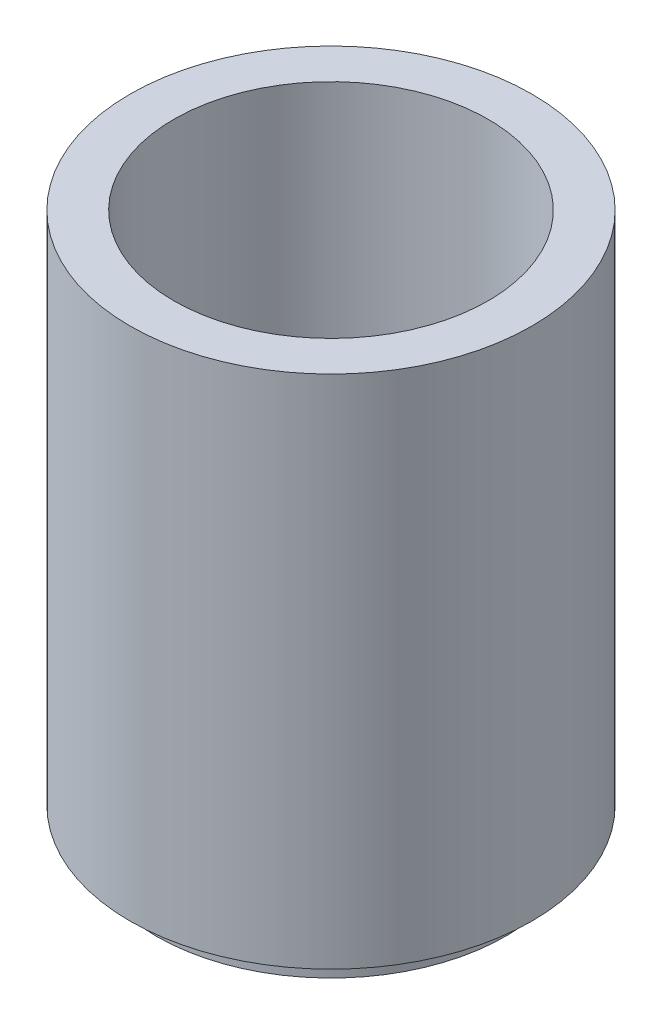
ISO-10303-21;
HEADER;
FILE_DESCRIPTION(('STEP AP214'),'2;1');
FILE_NAME('part.step','',(''),(''),'','','');
FILE_SCHEMA(('AUTOMOTIVE_DESIGN { 1 0 10303 214 1 1 1 1 }'));
ENDSEC;
DATA;
#1=APPLICATION_CONTEXT('core data for automotive mechanical design processes');
#2=APPLICATION_PROTOCOL_DEFINITION('international standard','automotive_design',2000,#1);
#3=PRODUCT_CONTEXT('',#1,'mechanical');
#4=PRODUCT('Part','Part','',(#3));
#5=PRODUCT_RELATED_PRODUCT_CATEGORY('part','',(#4));
#6=PRODUCT_DEFINITION_FORMATION('','',#4);
#7=PRODUCT_DEFINITION_CONTEXT('part definition',#1,'design');
#8=PRODUCT_DEFINITION('design','',#6,#7);
#9=PRODUCT_DEFINITION_SHAPE('','',#8);
#10=(LENGTH_UNIT() NAMED_UNIT(*) SI_UNIT(.MILLI.,.METRE.));
#11=(NAMED_UNIT(*) PLANE_ANGLE_UNIT() SI_UNIT($,.RADIAN.));
#12=(NAMED_UNIT(*) SI_UNIT($,.STERADIAN.) SOLID_ANGLE_UNIT());
#13=UNCERTAINTY_MEASURE_WITH_UNIT(LENGTH_MEASURE(1.E-05),#10,'distance_accuracy_value','');
#14=(GEOMETRIC_REPRESENTATION_CONTEXT(3) GLOBAL_UNCERTAINTY_ASSIGNED_CONTEXT((#13)) GLOBAL_UNIT_ASSIGNED_CONTEXT((#10,
#11,#12)) REPRESENTATION_CONTEXT('',''));
#15=CARTESIAN_POINT('',(0.,0.,0.));
#16=DIRECTION('',(0.,0.,1.));
#17=DIRECTION('',(1.,0.,0.));
#18=AXIS2_PLACEMENT_3D('',#15,#16,#17);
#19=CARTESIAN_POINT('',(8.00000000000001,-23.,0.));
#20=DIRECTION('',(0.,-1.,0.));
#21=DIRECTION('',(0.,0.,-1.));
#22=AXIS2_PLACEMENT_3D('',#19,#20,#21);
#23=PLANE('',#22);
#24=CARTESIAN_POINT('',(0.,-23.,0.));
#25=DIRECTION('',(0.,1.,0.));
#26=DIRECTION('',(0.,0.,1.));
#27=AXIS2_PLACEMENT_3D('',#24,#25,#26);
#28=CIRCLE('',#27,8.00000000000001);
#29=CARTESIAN_POINT('',(0.,-23.,8.00000000000001));
#30=VERTEX_POINT('',#29);
#31=EDGE_CURVE('E10',#30,#30,#28,.T.);
#32=ORIENTED_EDGE('',*,*,#31,.F.);
#33=EDGE_LOOP('',(#32));
#34=FACE_BOUND('',#33,.T.);
#35=CARTESIAN_POINT('',(0.,-23.,0.));
#36=DIRECTION('',(0.,1.,0.));
#37=DIRECTION('',(0.,0.,1.));
#38=AXIS2_PLACEMENT_3D('',#35,#36,#37);
#39=CIRCLE('',#38,9.00000000000001);
#40=CARTESIAN_POINT('',(0.,-23.,9.00000000000001));
#41=VERTEX_POINT('',#40);
#42=EDGE_CURVE('E66',#41,#41,#39,.T.);
#43=ORIENTED_EDGE('',*,*,#42,.T.);
#44=EDGE_LOOP('',(#43));
#45=FACE_BOUND('',#44,.T.);
#46=ADVANCED_FACE('F38',(#34,#45),#23,.F.);
#47=CARTESIAN_POINT('',(0.,34.,0.));
#48=DIRECTION('',(0.,1.,0.));
#49=DIRECTION('',(0.,0.,1.));
#50=AXIS2_PLACEMENT_3D('',#47,#48,#49);
#51=CYLINDRICAL_SURFACE('',#50,8.00000000000001);
#52=CARTESIAN_POINT('',(0.,-31.,0.));
#53=DIRECTION('',(0.,1.,0.));
#54=DIRECTION('',(0.,0.,1.));
#55=AXIS2_PLACEMENT_3D('',#52,#53,#54);
#56=CIRCLE('',#55,8.00000000000001);
#57=CARTESIAN_POINT('',(0.,-31.,8.00000000000001));
#58=VERTEX_POINT('',#57);
#59=EDGE_CURVE('E44',#58,#58,#56,.T.);
#60=ORIENTED_EDGE('',*,*,#59,.F.);
#61=EDGE_LOOP('',(#60));
#62=FACE_BOUND('',#61,.T.);
#63=ORIENTED_EDGE('',*,*,#31,.T.);
#64=EDGE_LOOP('',(#63));
#65=FACE_BOUND('',#64,.T.);
#66=ADVANCED_FACE('F103',(#62,#65),#51,.F.);
#67=CARTESIAN_POINT('',(10.,-31.,0.));
#68=DIRECTION('',(0.,1.,0.));
#69=DIRECTION('',(0.,0.,1.));
#70=AXIS2_PLACEMENT_3D('',#67,#68,#69);
#71=PLANE('',#70);
#72=CARTESIAN_POINT('',(0.,-31.,0.));
#73=DIRECTION('',(0.,1.,0.));
#74=DIRECTION('',(0.,0.,1.));
#75=AXIS2_PLACEMENT_3D('',#72,#73,#74);
#76=CIRCLE('',#75,10.);
#77=CARTESIAN_POINT('',(0.,-31.,10.));
#78=VERTEX_POINT('',#77);
#79=EDGE_CURVE('E48',#78,#78,#76,.T.);
#80=ORIENTED_EDGE('',*,*,#79,.F.);
#81=EDGE_LOOP('',(#80));
#82=FACE_BOUND('',#81,.T.);
#83=ORIENTED_EDGE('',*,*,#59,.T.);
#84=EDGE_LOOP('',(#83));
#85=FACE_BOUND('',#84,.T.);
#86=ADVANCED_FACE('F98',(#82,#85),#71,.F.);
#87=CARTESIAN_POINT('',(0.,34.,0.));
#88=DIRECTION('',(0.,1.,0.));
#89=DIRECTION('',(0.,0.,1.));
#90=AXIS2_PLACEMENT_3D('',#87,#88,#89);
#91=CYLINDRICAL_SURFACE('',#90,10.);
#92=CARTESIAN_POINT('',(0.,-29.5,0.));
#93=DIRECTION('',(0.,1.,0.));
#94=DIRECTION('',(0.,0.,1.));
#95=AXIS2_PLACEMENT_3D('',#92,#93,#94);
#96=CIRCLE('',#95,10.);
#97=CARTESIAN_POINT('',(0.,-29.5,10.));
#98=VERTEX_POINT('',#97);
#99=EDGE_CURVE('E52',#98,#98,#96,.T.);
#100=ORIENTED_EDGE('',*,*,#99,.F.);
#101=EDGE_LOOP('',(#100));
#102=FACE_BOUND('',#101,.T.);
#103=ORIENTED_EDGE('',*,*,#79,.T.);
#104=EDGE_LOOP('',(#103));
#105=FACE_BOUND('',#104,.T.);
#106=ADVANCED_FACE('F92',(#102,#105),#91,.T.);
#107=CARTESIAN_POINT('',(11.5,-29.5,0.));
#108=DIRECTION('',(0.,1.,0.));
#109=DIRECTION('',(0.,0.,1.));
#110=AXIS2_PLACEMENT_3D('',#107,#108,#109);
#111=PLANE('',#110);
#112=CARTESIAN_POINT('',(0.,-29.5,0.));
#113=DIRECTION('',(0.,1.,0.));
#114=DIRECTION('',(0.,0.,1.));
#115=AXIS2_PLACEMENT_3D('',#112,#113,#114);
#116=CIRCLE('',#115,11.5);
#117=CARTESIAN_POINT('',(0.,-29.5,11.5));
#118=VERTEX_POINT('',#117);
#119=EDGE_CURVE('E57',#118,#118,#116,.T.);
#120=ORIENTED_EDGE('',*,*,#119,.F.);
#121=EDGE_LOOP('',(#120));
#122=FACE_BOUND('',#121,.T.);
#123=ORIENTED_EDGE('',*,*,#99,.T.);
#124=EDGE_LOOP('',(#123));
#125=FACE_BOUND('',#124,.T.);
#126=ADVANCED_FACE('F86',(#122,#125),#111,.F.);
#127=CARTESIAN_POINT('',(0.,34.,0.));
#128=DIRECTION('',(0.,1.,0.));
#129=DIRECTION('',(0.,0.,1.));
#130=AXIS2_PLACEMENT_3D('',#127,#128,#129);
#131=CYLINDRICAL_SURFACE('',#130,11.5);
#132=CARTESIAN_POINT('',(0.,0.,0.));
#133=DIRECTION('',(0.,1.,0.));
#134=DIRECTION('',(0.,0.,1.));
#135=AXIS2_PLACEMENT_3D('',#132,#133,#134);
#136=CIRCLE('',#135,11.5);
#137=CARTESIAN_POINT('',(0.,0.,11.5));
#138=VERTEX_POINT('',#137);
#139=EDGE_CURVE('E60',#138,#138,#136,.T.);
#140=ORIENTED_EDGE('',*,*,#139,.F.);
#141=EDGE_LOOP('',(#140));
#142=FACE_BOUND('',#141,.T.);
#143=ORIENTED_EDGE('',*,*,#119,.T.);
#144=EDGE_LOOP('',(#143));
#145=FACE_BOUND('',#144,.T.);
#146=ADVANCED_FACE('F80',(#142,#145),#131,.T.);
#147=CARTESIAN_POINT('',(9.00000000000001,0.,0.));
#148=DIRECTION('',(0.,-1.,0.));
#149=DIRECTION('',(0.,0.,-1.));
#150=AXIS2_PLACEMENT_3D('',#147,#148,#149);
#151=PLANE('',#150);
#152=CARTESIAN_POINT('',(0.,0.,0.));
#153=DIRECTION('',(0.,1.,0.));
#154=DIRECTION('',(0.,0.,1.));
#155=AXIS2_PLACEMENT_3D('',#152,#153,#154);
#156=CIRCLE('',#155,9.00000000000001);
#157=CARTESIAN_POINT('',(0.,0.,9.00000000000001));
#158=VERTEX_POINT('',#157);
#159=EDGE_CURVE('E63',#158,#158,#156,.T.);
#160=ORIENTED_EDGE('',*,*,#159,.F.);
#161=EDGE_LOOP('',(#160));
#162=FACE_BOUND('',#161,.T.);
#163=ORIENTED_EDGE('',*,*,#139,.T.);
#164=EDGE_LOOP('',(#163));
#165=FACE_BOUND('',#164,.T.);
#166=ADVANCED_FACE('F74',(#162,#165),#151,.F.);
#167=CARTESIAN_POINT('',(0.,34.,0.));
#168=DIRECTION('',(0.,1.,0.));
#169=DIRECTION('',(0.,0.,1.));
#170=AXIS2_PLACEMENT_3D('',#167,#168,#169);
#171=CYLINDRICAL_SURFACE('',#170,9.00000000000001);
#172=ORIENTED_EDGE('',*,*,#42,.F.);
#173=EDGE_LOOP('',(#172));
#174=FACE_BOUND('',#173,.T.);
#175=ORIENTED_EDGE('',*,*,#159,.T.);
#176=EDGE_LOOP('',(#175));
#177=FACE_BOUND('',#176,.T.);
#178=ADVANCED_FACE('F71',(#174,#177),#171,.F.);
#179=CLOSED_SHELL('',(#46,#66,#86,#106,#126,#146,#166,#178));
#180=MANIFOLD_SOLID_BREP('B2',#179);
#181=ADVANCED_BREP_SHAPE_REPRESENTATION('',(#18,#180),#14);
#182=SHAPE_DEFINITION_REPRESENTATION(#9,#181);
ENDSEC;
END-ISO-10303-21;
